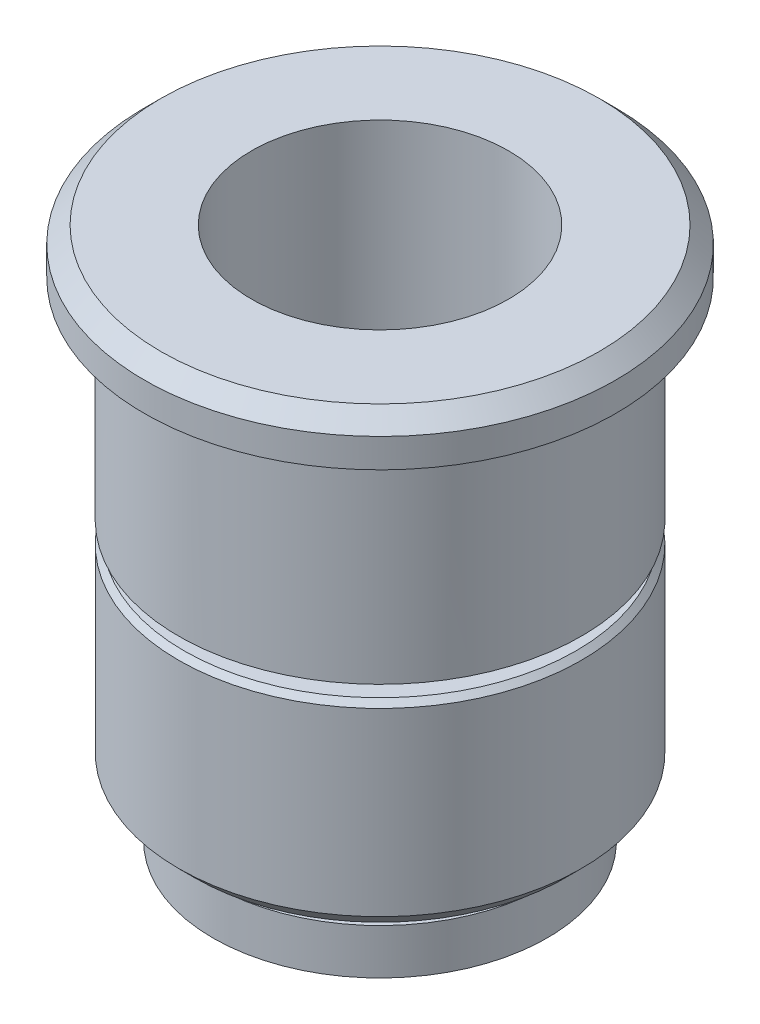
ISO-10303-21;
HEADER;
FILE_DESCRIPTION(('STEP AP214'),'2;1');
FILE_NAME('part.step','',(''),(''),'','','');
FILE_SCHEMA(('AUTOMOTIVE_DESIGN { 1 0 10303 214 1 1 1 1 }'));
ENDSEC;
DATA;
#1=APPLICATION_CONTEXT('core data for automotive mechanical design processes');
#2=APPLICATION_PROTOCOL_DEFINITION('international standard','automotive_design',2000,#1);
#3=PRODUCT_CONTEXT('',#1,'mechanical');
#4=PRODUCT('Part','Part','',(#3));
#5=PRODUCT_RELATED_PRODUCT_CATEGORY('part','',(#4));
#6=PRODUCT_DEFINITION_FORMATION('','',#4);
#7=PRODUCT_DEFINITION_CONTEXT('part definition',#1,'design');
#8=PRODUCT_DEFINITION('design','',#6,#7);
#9=PRODUCT_DEFINITION_SHAPE('','',#8);
#10=(LENGTH_UNIT() NAMED_UNIT(*) SI_UNIT(.MILLI.,.METRE.));
#11=(NAMED_UNIT(*) PLANE_ANGLE_UNIT() SI_UNIT($,.RADIAN.));
#12=(NAMED_UNIT(*) SI_UNIT($,.STERADIAN.) SOLID_ANGLE_UNIT());
#13=UNCERTAINTY_MEASURE_WITH_UNIT(LENGTH_MEASURE(1.E-05),#10,'distance_accuracy_value','');
#14=(GEOMETRIC_REPRESENTATION_CONTEXT(3) GLOBAL_UNCERTAINTY_ASSIGNED_CONTEXT((#13)) GLOBAL_UNIT_ASSIGNED_CONTEXT((#10,
#11,#12)) REPRESENTATION_CONTEXT('',''));
#15=CARTESIAN_POINT('',(0.,0.,0.));
#16=DIRECTION('',(0.,0.,1.));
#17=DIRECTION('',(1.,0.,0.));
#18=AXIS2_PLACEMENT_3D('',#15,#16,#17);
#19=CARTESIAN_POINT('',(0.,0.,0.));
#20=DIRECTION('',(0.,-1.,0.));
#21=DIRECTION('',(0.,0.,-1.));
#22=AXIS2_PLACEMENT_3D('',#19,#20,#21);
#23=PLANE('',#22);
#24=CARTESIAN_POINT('',(0.,0.,0.));
#25=DIRECTION('',(0.,-1.,0.));
#26=DIRECTION('',(0.,0.,-1.));
#27=AXIS2_PLACEMENT_3D('',#24,#25,#26);
#28=CIRCLE('',#27,1.5);
#29=CARTESIAN_POINT('',(0.,0.,-1.5));
#30=VERTEX_POINT('',#29);
#31=EDGE_CURVE('E97',#30,#30,#28,.T.);
#32=ORIENTED_EDGE('',*,*,#31,.F.);
#33=EDGE_LOOP('',(#32));
#34=FACE_BOUND('',#33,.T.);
#35=CARTESIAN_POINT('',(0.,0.,0.));
#36=DIRECTION('',(0.,-1.,0.));
#37=DIRECTION('',(0.,0.,-1.));
#38=AXIS2_PLACEMENT_3D('',#35,#36,#37);
#39=CIRCLE('',#38,1.95);
#40=CARTESIAN_POINT('',(0.,0.,-1.95));
#41=VERTEX_POINT('',#40);
#42=EDGE_CURVE('E64',#41,#41,#39,.T.);
#43=ORIENTED_EDGE('',*,*,#42,.T.);
#44=EDGE_LOOP('',(#43));
#45=FACE_BOUND('',#44,.T.);
#46=ADVANCED_FACE('F32',(#34,#45),#23,.T.);
#47=CARTESIAN_POINT('',(0.,0.,0.));
#48=DIRECTION('',(0.,-1.,0.));
#49=DIRECTION('',(0.,0.,-1.));
#50=AXIS2_PLACEMENT_3D('',#47,#48,#49);
#51=CYLINDRICAL_SURFACE('',#50,1.95);
#52=CARTESIAN_POINT('',(0.,0.53,0.));
#53=DIRECTION('',(0.,-1.,0.));
#54=DIRECTION('',(0.,0.,-1.));
#55=AXIS2_PLACEMENT_3D('',#52,#53,#54);
#56=CIRCLE('',#55,1.95);
#57=CARTESIAN_POINT('',(0.,0.53,-1.95));
#58=VERTEX_POINT('',#57);
#59=EDGE_CURVE('E67',#58,#58,#56,.T.);
#60=ORIENTED_EDGE('',*,*,#59,.T.);
#61=EDGE_LOOP('',(#60));
#62=FACE_BOUND('',#61,.T.);
#63=ORIENTED_EDGE('',*,*,#42,.F.);
#64=EDGE_LOOP('',(#63));
#65=FACE_BOUND('',#64,.T.);
#66=ADVANCED_FACE('F105',(#62,#65),#51,.T.);
#67=CARTESIAN_POINT('',(1.95,0.53,0.));
#68=DIRECTION('',(0.,1.,0.));
#69=DIRECTION('',(0.,0.,1.));
#70=AXIS2_PLACEMENT_3D('',#67,#68,#69);
#71=PLANE('',#70);
#72=CARTESIAN_POINT('',(0.,0.529999999999999,0.));
#73=DIRECTION('',(0.,-1.,0.));
#74=DIRECTION('',(0.,0.,-1.));
#75=AXIS2_PLACEMENT_3D('',#72,#73,#74);
#76=CIRCLE('',#75,1.725);
#77=CARTESIAN_POINT('',(0.,0.529999999999999,-1.725));
#78=VERTEX_POINT('',#77);
#79=EDGE_CURVE('E70',#78,#78,#76,.T.);
#80=ORIENTED_EDGE('',*,*,#79,.T.);
#81=EDGE_LOOP('',(#80));
#82=FACE_BOUND('',#81,.T.);
#83=ORIENTED_EDGE('',*,*,#59,.F.);
#84=EDGE_LOOP('',(#83));
#85=FACE_BOUND('',#84,.T.);
#86=ADVANCED_FACE('F110',(#82,#85),#71,.T.);
#87=CARTESIAN_POINT('',(0.,0.,0.));
#88=DIRECTION('',(0.,-1.,0.));
#89=DIRECTION('',(0.,0.,-1.));
#90=AXIS2_PLACEMENT_3D('',#87,#88,#89);
#91=CYLINDRICAL_SURFACE('',#90,1.725);
#92=CARTESIAN_POINT('',(0.,0.709999999999999,0.));
#93=DIRECTION('',(0.,-1.,0.));
#94=DIRECTION('',(0.,0.,-1.));
#95=AXIS2_PLACEMENT_3D('',#92,#93,#94);
#96=CIRCLE('',#95,1.725);
#97=CARTESIAN_POINT('',(0.,0.709999999999999,-1.725));
#98=VERTEX_POINT('',#97);
#99=EDGE_CURVE('E73',#98,#98,#96,.T.);
#100=ORIENTED_EDGE('',*,*,#99,.T.);
#101=EDGE_LOOP('',(#100));
#102=FACE_BOUND('',#101,.T.);
#103=ORIENTED_EDGE('',*,*,#79,.F.);
#104=EDGE_LOOP('',(#103));
#105=FACE_BOUND('',#104,.T.);
#106=ADVANCED_FACE('F116',(#102,#105),#91,.T.);
#107=CARTESIAN_POINT('',(1.725,0.709999999999999,0.));
#108=DIRECTION('',(0.,-1.,0.));
#109=DIRECTION('',(0.,0.,-1.));
#110=AXIS2_PLACEMENT_3D('',#107,#108,#109);
#111=PLANE('',#110);
#112=CARTESIAN_POINT('',(0.,0.709999999999999,0.));
#113=DIRECTION('',(0.,-1.,0.));
#114=DIRECTION('',(0.,0.,-1.));
#115=AXIS2_PLACEMENT_3D('',#112,#113,#114);
#116=CIRCLE('',#115,2.1575);
#117=CARTESIAN_POINT('',(0.,0.709999999999999,2.1575));
#118=VERTEX_POINT('',#117);
#119=EDGE_CURVE('E47',#118,#118,#116,.T.);
#120=ORIENTED_EDGE('',*,*,#119,.T.);
#121=EDGE_LOOP('',(#120));
#122=FACE_BOUND('',#121,.T.);
#123=ORIENTED_EDGE('',*,*,#99,.F.);
#124=EDGE_LOOP('',(#123));
#125=FACE_BOUND('',#124,.T.);
#126=ADVANCED_FACE('F139',(#122,#125),#111,.T.);
#127=CARTESIAN_POINT('',(0.,0.,0.));
#128=DIRECTION('',(0.,-1.,0.));
#129=DIRECTION('',(0.,0.,-1.));
#130=AXIS2_PLACEMENT_3D('',#127,#128,#129);
#131=CYLINDRICAL_SURFACE('',#130,2.35);
#132=CARTESIAN_POINT('',(0.,0.902499999999998,0.));
#133=DIRECTION('',(0.,-1.,0.));
#134=DIRECTION('',(0.,0.,-1.));
#135=AXIS2_PLACEMENT_3D('',#132,#133,#134);
#136=CIRCLE('',#135,2.35);
#137=CARTESIAN_POINT('',(0.,0.902499999999998,2.35));
#138=VERTEX_POINT('',#137);
#139=EDGE_CURVE('E43',#138,#138,#136,.F.);
#140=ORIENTED_EDGE('',*,*,#139,.T.);
#141=EDGE_LOOP('',(#140));
#142=FACE_BOUND('',#141,.T.);
#143=CARTESIAN_POINT('',(0.,3.0065,0.));
#144=DIRECTION('',(0.,1.,0.));
#145=DIRECTION('',(0.,0.,1.));
#146=AXIS2_PLACEMENT_3D('',#143,#144,#145);
#147=CIRCLE('',#146,2.35);
#148=CARTESIAN_POINT('',(0.,3.0065,2.35));
#149=VERTEX_POINT('',#148);
#150=EDGE_CURVE('E61',#149,#149,#147,.F.);
#151=ORIENTED_EDGE('',*,*,#150,.T.);
#152=EDGE_LOOP('',(#151));
#153=FACE_BOUND('',#152,.T.);
#154=ADVANCED_FACE('F142',(#142,#153),#131,.T.);
#155=CARTESIAN_POINT('',(2.35,3.07,0.));
#156=DIRECTION('',(0.,1.,0.));
#157=DIRECTION('',(0.,0.,1.));
#158=AXIS2_PLACEMENT_3D('',#155,#156,#157);
#159=PLANE('',#158);
#160=CARTESIAN_POINT('',(0.,3.07,0.));
#161=DIRECTION('',(0.,1.,0.));
#162=DIRECTION('',(0.,0.,1.));
#163=AXIS2_PLACEMENT_3D('',#160,#161,#162);
#164=CIRCLE('',#163,2.2865);
#165=CARTESIAN_POINT('',(0.,3.07,2.2865));
#166=VERTEX_POINT('',#165);
#167=EDGE_CURVE('E58',#166,#166,#164,.T.);
#168=ORIENTED_EDGE('',*,*,#167,.T.);
#169=EDGE_LOOP('',(#168));
#170=FACE_BOUND('',#169,.T.);
#171=CARTESIAN_POINT('',(0.,3.07,0.));
#172=DIRECTION('',(0.,-1.,0.));
#173=DIRECTION('',(0.,0.,-1.));
#174=AXIS2_PLACEMENT_3D('',#171,#172,#173);
#175=CIRCLE('',#174,1.725);
#176=CARTESIAN_POINT('',(0.,3.07,-1.725));
#177=VERTEX_POINT('',#176);
#178=EDGE_CURVE('E76',#177,#177,#175,.T.);
#179=ORIENTED_EDGE('',*,*,#178,.T.);
#180=EDGE_LOOP('',(#179));
#181=FACE_BOUND('',#180,.T.);
#182=ADVANCED_FACE('F156',(#170,#181),#159,.T.);
#183=CARTESIAN_POINT('',(0.,0.,0.));
#184=DIRECTION('',(0.,-1.,0.));
#185=DIRECTION('',(0.,0.,-1.));
#186=AXIS2_PLACEMENT_3D('',#183,#184,#185);
#187=CYLINDRICAL_SURFACE('',#186,1.725);
#188=CARTESIAN_POINT('',(0.,3.25,0.));
#189=DIRECTION('',(0.,-1.,0.));
#190=DIRECTION('',(0.,0.,-1.));
#191=AXIS2_PLACEMENT_3D('',#188,#189,#190);
#192=CIRCLE('',#191,1.725);
#193=CARTESIAN_POINT('',(0.,3.25,-1.725));
#194=VERTEX_POINT('',#193);
#195=EDGE_CURVE('E79',#194,#194,#192,.T.);
#196=ORIENTED_EDGE('',*,*,#195,.T.);
#197=EDGE_LOOP('',(#196));
#198=FACE_BOUND('',#197,.T.);
#199=ORIENTED_EDGE('',*,*,#178,.F.);
#200=EDGE_LOOP('',(#199));
#201=FACE_BOUND('',#200,.T.);
#202=ADVANCED_FACE('F160',(#198,#201),#187,.T.);
#203=CARTESIAN_POINT('',(1.725,3.25,0.));
#204=DIRECTION('',(0.,-1.,0.));
#205=DIRECTION('',(0.,0.,-1.));
#206=AXIS2_PLACEMENT_3D('',#203,#204,#205);
#207=PLANE('',#206);
#208=CARTESIAN_POINT('',(0.,3.25,0.));
#209=DIRECTION('',(0.,-1.,0.));
#210=DIRECTION('',(0.,0.,-1.));
#211=AXIS2_PLACEMENT_3D('',#208,#209,#210);
#212=CIRCLE('',#211,2.35);
#213=CARTESIAN_POINT('',(0.,3.25,-2.35));
#214=VERTEX_POINT('',#213);
#215=EDGE_CURVE('E82',#214,#214,#212,.T.);
#216=ORIENTED_EDGE('',*,*,#215,.T.);
#217=EDGE_LOOP('',(#216));
#218=FACE_BOUND('',#217,.T.);
#219=ORIENTED_EDGE('',*,*,#195,.F.);
#220=EDGE_LOOP('',(#219));
#221=FACE_BOUND('',#220,.T.);
#222=ADVANCED_FACE('F164',(#218,#221),#207,.T.);
#223=CARTESIAN_POINT('',(0.,0.,0.));
#224=DIRECTION('',(0.,-1.,0.));
#225=DIRECTION('',(0.,0.,-1.));
#226=AXIS2_PLACEMENT_3D('',#223,#224,#225);
#227=CYLINDRICAL_SURFACE('',#226,2.35);
#228=CARTESIAN_POINT('',(0.,5.5465,0.));
#229=DIRECTION('',(0.,1.,0.));
#230=DIRECTION('',(0.,0.,1.));
#231=AXIS2_PLACEMENT_3D('',#228,#229,#230);
#232=CIRCLE('',#231,2.35);
#233=CARTESIAN_POINT('',(0.,5.5465,2.35));
#234=VERTEX_POINT('',#233);
#235=EDGE_CURVE('E55',#234,#234,#232,.F.);
#236=ORIENTED_EDGE('',*,*,#235,.T.);
#237=EDGE_LOOP('',(#236));
#238=FACE_BOUND('',#237,.T.);
#239=ORIENTED_EDGE('',*,*,#215,.F.);
#240=EDGE_LOOP('',(#239));
#241=FACE_BOUND('',#240,.T.);
#242=ADVANCED_FACE('F168',(#238,#241),#227,.T.);
#243=CARTESIAN_POINT('',(2.35,5.61,0.));
#244=DIRECTION('',(0.,1.,0.));
#245=DIRECTION('',(0.,0.,1.));
#246=AXIS2_PLACEMENT_3D('',#243,#244,#245);
#247=PLANE('',#246);
#248=CARTESIAN_POINT('',(0.,5.61,0.));
#249=DIRECTION('',(0.,1.,0.));
#250=DIRECTION('',(0.,0.,1.));
#251=AXIS2_PLACEMENT_3D('',#248,#249,#250);
#252=CIRCLE('',#251,2.2865);
#253=CARTESIAN_POINT('',(0.,5.61,2.2865));
#254=VERTEX_POINT('',#253);
#255=EDGE_CURVE('E52',#254,#254,#252,.T.);
#256=ORIENTED_EDGE('',*,*,#255,.T.);
#257=EDGE_LOOP('',(#256));
#258=FACE_BOUND('',#257,.T.);
#259=CARTESIAN_POINT('',(0.,5.61,0.));
#260=DIRECTION('',(0.,-1.,0.));
#261=DIRECTION('',(0.,0.,-1.));
#262=AXIS2_PLACEMENT_3D('',#259,#260,#261);
#263=CIRCLE('',#262,1.725);
#264=CARTESIAN_POINT('',(0.,5.61,-1.725));
#265=VERTEX_POINT('',#264);
#266=EDGE_CURVE('E85',#265,#265,#263,.T.);
#267=ORIENTED_EDGE('',*,*,#266,.T.);
#268=EDGE_LOOP('',(#267));
#269=FACE_BOUND('',#268,.T.);
#270=ADVANCED_FACE('F172',(#258,#269),#247,.T.);
#271=CARTESIAN_POINT('',(0.,0.,0.));
#272=DIRECTION('',(0.,-1.,0.));
#273=DIRECTION('',(0.,0.,-1.));
#274=AXIS2_PLACEMENT_3D('',#271,#272,#273);
#275=CYLINDRICAL_SURFACE('',#274,1.725);
#276=CARTESIAN_POINT('',(0.,5.7,0.));
#277=DIRECTION('',(0.,-1.,0.));
#278=DIRECTION('',(0.,0.,-1.));
#279=AXIS2_PLACEMENT_3D('',#276,#277,#278);
#280=CIRCLE('',#279,1.725);
#281=CARTESIAN_POINT('',(0.,5.7,-1.725));
#282=VERTEX_POINT('',#281);
#283=EDGE_CURVE('E88',#282,#282,#280,.T.);
#284=ORIENTED_EDGE('',*,*,#283,.T.);
#285=EDGE_LOOP('',(#284));
#286=FACE_BOUND('',#285,.T.);
#287=ORIENTED_EDGE('',*,*,#266,.F.);
#288=EDGE_LOOP('',(#287));
#289=FACE_BOUND('',#288,.T.);
#290=ADVANCED_FACE('F176',(#286,#289),#275,.T.);
#291=CARTESIAN_POINT('',(1.725,5.7,0.));
#292=DIRECTION('',(0.,-1.,0.));
#293=DIRECTION('',(0.,0.,-1.));
#294=AXIS2_PLACEMENT_3D('',#291,#292,#293);
#295=PLANE('',#294);
#296=CARTESIAN_POINT('',(0.,5.7,0.));
#297=DIRECTION('',(0.,-1.,0.));
#298=DIRECTION('',(0.,0.,-1.));
#299=AXIS2_PLACEMENT_3D('',#296,#297,#298);
#300=CIRCLE('',#299,2.75);
#301=CARTESIAN_POINT('',(0.,5.7,-2.75));
#302=VERTEX_POINT('',#301);
#303=EDGE_CURVE('E91',#302,#302,#300,.T.);
#304=ORIENTED_EDGE('',*,*,#303,.T.);
#305=EDGE_LOOP('',(#304));
#306=FACE_BOUND('',#305,.T.);
#307=ORIENTED_EDGE('',*,*,#283,.F.);
#308=EDGE_LOOP('',(#307));
#309=FACE_BOUND('',#308,.T.);
#310=ADVANCED_FACE('F180',(#306,#309),#295,.T.);
#311=CARTESIAN_POINT('',(0.,0.,0.));
#312=DIRECTION('',(0.,-1.,0.));
#313=DIRECTION('',(0.,0.,-1.));
#314=AXIS2_PLACEMENT_3D('',#311,#312,#313);
#315=CYLINDRICAL_SURFACE('',#314,2.75);
#316=CARTESIAN_POINT('',(0.,6.0375,0.));
#317=DIRECTION('',(0.,1.,0.));
#318=DIRECTION('',(0.,0.,1.));
#319=AXIS2_PLACEMENT_3D('',#316,#317,#318);
#320=CIRCLE('',#319,2.75);
#321=CARTESIAN_POINT('',(0.,6.0375,-2.75));
#322=VERTEX_POINT('',#321);
#323=EDGE_CURVE('E39',#322,#322,#320,.F.);
#324=ORIENTED_EDGE('',*,*,#323,.T.);
#325=EDGE_LOOP('',(#324));
#326=FACE_BOUND('',#325,.T.);
#327=ORIENTED_EDGE('',*,*,#303,.F.);
#328=EDGE_LOOP('',(#327));
#329=FACE_BOUND('',#328,.T.);
#330=ADVANCED_FACE('F184',(#326,#329),#315,.T.);
#331=CARTESIAN_POINT('',(2.75,6.23,0.));
#332=DIRECTION('',(0.,1.,0.));
#333=DIRECTION('',(0.,0.,1.));
#334=AXIS2_PLACEMENT_3D('',#331,#332,#333);
#335=PLANE('',#334);
#336=CARTESIAN_POINT('',(0.,6.23,0.));
#337=DIRECTION('',(0.,1.,0.));
#338=DIRECTION('',(0.,0.,1.));
#339=AXIS2_PLACEMENT_3D('',#336,#337,#338);
#340=CIRCLE('',#339,2.5575);
#341=CARTESIAN_POINT('',(0.,6.23,-2.5575));
#342=VERTEX_POINT('',#341);
#343=EDGE_CURVE('E10',#342,#342,#340,.T.);
#344=ORIENTED_EDGE('',*,*,#343,.T.);
#345=EDGE_LOOP('',(#344));
#346=FACE_BOUND('',#345,.T.);
#347=CARTESIAN_POINT('',(0.,6.23,0.));
#348=DIRECTION('',(0.,-1.,0.));
#349=DIRECTION('',(0.,0.,-1.));
#350=AXIS2_PLACEMENT_3D('',#347,#348,#349);
#351=CIRCLE('',#350,1.5);
#352=CARTESIAN_POINT('',(0.,6.23,-1.5));
#353=VERTEX_POINT('',#352);
#354=EDGE_CURVE('E94',#353,#353,#351,.T.);
#355=ORIENTED_EDGE('',*,*,#354,.T.);
#356=EDGE_LOOP('',(#355));
#357=FACE_BOUND('',#356,.T.);
#358=ADVANCED_FACE('F188',(#346,#357),#335,.T.);
#359=CARTESIAN_POINT('',(0.,0.,0.));
#360=DIRECTION('',(0.,-1.,0.));
#361=DIRECTION('',(0.,0.,-1.));
#362=AXIS2_PLACEMENT_3D('',#359,#360,#361);
#363=CYLINDRICAL_SURFACE('',#362,1.5);
#364=ORIENTED_EDGE('',*,*,#354,.F.);
#365=EDGE_LOOP('',(#364));
#366=FACE_BOUND('',#365,.T.);
#367=ORIENTED_EDGE('',*,*,#31,.T.);
#368=EDGE_LOOP('',(#367));
#369=FACE_BOUND('',#368,.T.);
#370=ADVANCED_FACE('F101',(#366,#369),#363,.F.);
#371=CARTESIAN_POINT('',(0.,3.0065,0.));
#372=DIRECTION('',(0.,-1.,0.));
#373=DIRECTION('',(0.,0.,-1.));
#374=AXIS2_PLACEMENT_3D('',#371,#372,#373);
#375=CONICAL_SURFACE('',#374,2.35,0.785398163397448);
#376=ORIENTED_EDGE('',*,*,#167,.F.);
#377=EDGE_LOOP('',(#376));
#378=FACE_BOUND('',#377,.T.);
#379=ORIENTED_EDGE('',*,*,#150,.F.);
#380=EDGE_LOOP('',(#379));
#381=FACE_BOUND('',#380,.T.);
#382=ADVANCED_FACE('F121',(#378,#381),#375,.T.);
#383=CARTESIAN_POINT('',(0.,5.5465,0.));
#384=DIRECTION('',(0.,-1.,0.));
#385=DIRECTION('',(0.,0.,-1.));
#386=AXIS2_PLACEMENT_3D('',#383,#384,#385);
#387=CONICAL_SURFACE('',#386,2.35,0.785398163397438);
#388=ORIENTED_EDGE('',*,*,#255,.F.);
#389=EDGE_LOOP('',(#388));
#390=FACE_BOUND('',#389,.T.);
#391=ORIENTED_EDGE('',*,*,#235,.F.);
#392=EDGE_LOOP('',(#391));
#393=FACE_BOUND('',#392,.T.);
#394=ADVANCED_FACE('F124',(#390,#393),#387,.T.);
#395=CARTESIAN_POINT('',(0.,0.709999999999999,0.));
#396=DIRECTION('',(0.,1.,0.));
#397=DIRECTION('',(0.,0.,1.));
#398=AXIS2_PLACEMENT_3D('',#395,#396,#397);
#399=CONICAL_SURFACE('',#398,2.1575,0.785398163397443);
#400=CARTESIAN_POINT('',(0.,0.902499999999998,2.35));
#401=CARTESIAN_POINT('',(0.,0.900494791666665,2.34799479166667));
#402=CARTESIAN_POINT('',(0.,0.898489583333332,2.34598958333333));
#403=CARTESIAN_POINT('',(0.,0.894479166666665,2.34197916666667));
#404=CARTESIAN_POINT('',(0.,0.892473958333332,2.33997395833333));
#405=CARTESIAN_POINT('',(0.,0.888463541666665,2.33596354166667));
#406=CARTESIAN_POINT('',(0.,0.886458333333332,2.33395833333333));
#407=CARTESIAN_POINT('',(0.,0.882447916666665,2.32994791666667));
#408=CARTESIAN_POINT('',(0.,0.880442708333332,2.32794270833333));
#409=CARTESIAN_POINT('',(0.,0.876432291666665,2.32393229166667));
#410=CARTESIAN_POINT('',(0.,0.874427083333332,2.32192708333333));
#411=CARTESIAN_POINT('',(0.,0.870416666666665,2.31791666666667));
#412=CARTESIAN_POINT('',(0.,0.868411458333332,2.31591145833333));
#413=CARTESIAN_POINT('',(0.,0.864401041666665,2.31190104166667));
#414=CARTESIAN_POINT('',(0.,0.862395833333332,2.30989583333333));
#415=CARTESIAN_POINT('',(0.,0.858385416666665,2.30588541666667));
#416=CARTESIAN_POINT('',(0.,0.856380208333332,2.30388020833333));
#417=CARTESIAN_POINT('',(0.,0.852369791666665,2.29986979166667));
#418=CARTESIAN_POINT('',(0.,0.850364583333332,2.29786458333333));
#419=CARTESIAN_POINT('',(0.,0.846354166666665,2.29385416666667));
#420=CARTESIAN_POINT('',(0.,0.844348958333332,2.29184895833333));
#421=CARTESIAN_POINT('',(0.,0.840338541666665,2.28783854166667));
#422=CARTESIAN_POINT('',(0.,0.838333333333332,2.28583333333333));
#423=CARTESIAN_POINT('',(0.,0.834322916666665,2.28182291666667));
#424=CARTESIAN_POINT('',(0.,0.832317708333332,2.27981770833333));
#425=CARTESIAN_POINT('',(0.,0.828307291666665,2.27580729166667));
#426=CARTESIAN_POINT('',(0.,0.826302083333332,2.27380208333333));
#427=CARTESIAN_POINT('',(0.,0.822291666666665,2.26979166666667));
#428=CARTESIAN_POINT('',(0.,0.820286458333332,2.26778645833333));
#429=CARTESIAN_POINT('',(0.,0.816276041666665,2.26377604166667));
#430=CARTESIAN_POINT('',(0.,0.814270833333332,2.26177083333333));
#431=CARTESIAN_POINT('',(0.,0.810260416666665,2.25776041666667));
#432=CARTESIAN_POINT('',(0.,0.808255208333332,2.25575520833334));
#433=CARTESIAN_POINT('',(0.,0.804244791666665,2.25174479166667));
#434=CARTESIAN_POINT('',(0.,0.802239583333332,2.24973958333334));
#435=CARTESIAN_POINT('',(0.,0.798229166666665,2.24572916666667));
#436=CARTESIAN_POINT('',(0.,0.796223958333332,2.24372395833334));
#437=CARTESIAN_POINT('',(0.,0.792213541666665,2.23971354166667));
#438=CARTESIAN_POINT('',(0.,0.790208333333332,2.23770833333334));
#439=CARTESIAN_POINT('',(0.,0.786197916666665,2.23369791666667));
#440=CARTESIAN_POINT('',(0.,0.784192708333332,2.23169270833334));
#441=CARTESIAN_POINT('',(0.,0.780182291666665,2.22768229166667));
#442=CARTESIAN_POINT('',(0.,0.778177083333332,2.22567708333334));
#443=CARTESIAN_POINT('',(0.,0.774166666666666,2.22166666666667));
#444=CARTESIAN_POINT('',(0.,0.772161458333332,2.21966145833334));
#445=CARTESIAN_POINT('',(0.,0.768151041666666,2.21565104166667));
#446=CARTESIAN_POINT('',(0.,0.766145833333332,2.21364583333334));
#447=CARTESIAN_POINT('',(0.,0.762135416666666,2.20963541666667));
#448=CARTESIAN_POINT('',(0.,0.760130208333332,2.20763020833334));
#449=CARTESIAN_POINT('',(0.,0.756119791666666,2.20361979166667));
#450=CARTESIAN_POINT('',(0.,0.754114583333332,2.20161458333334));
#451=CARTESIAN_POINT('',(0.,0.750104166666666,2.19760416666667));
#452=CARTESIAN_POINT('',(0.,0.748098958333332,2.19559895833334));
#453=CARTESIAN_POINT('',(0.,0.744088541666666,2.19158854166667));
#454=CARTESIAN_POINT('',(0.,0.742083333333332,2.18958333333334));
#455=CARTESIAN_POINT('',(0.,0.738072916666666,2.18557291666667));
#456=CARTESIAN_POINT('',(0.,0.736067708333332,2.18356770833334));
#457=CARTESIAN_POINT('',(0.,0.732057291666666,2.17955729166667));
#458=CARTESIAN_POINT('',(0.,0.730052083333332,2.17755208333334));
#459=CARTESIAN_POINT('',(0.,0.726041666666666,2.17354166666667));
#460=CARTESIAN_POINT('',(0.,0.724036458333333,2.17153645833334));
#461=CARTESIAN_POINT('',(0.,0.720026041666666,2.16752604166667));
#462=CARTESIAN_POINT('',(0.,0.718020833333333,2.16552083333334));
#463=CARTESIAN_POINT('',(0.,0.714010416666666,2.16151041666667));
#464=CARTESIAN_POINT('',(0.,0.712005208333332,2.15950520833334));
#465=CARTESIAN_POINT('',(0.,0.709999999999999,2.1575));
#466=B_SPLINE_CURVE_WITH_KNOTS('',3,(#400,#401,#402,#403,#404,#405,#406,#407,#408,#409,#410,
#411,#412,#413,#414,#415,#416,#417,#418,#419,#420,#421,#422,#423,#424,#425,#426,#427,#428,#429,
#430,#431,#432,#433,#434,#435,#436,#437,#438,#439,#440,#441,#442,#443,#444,#445,#446,#447,#448,
#449,#450,#451,#452,#453,#454,#455,#456,#457,#458,#459,#460,#461,#462,#463,#464,#465),
.UNSPECIFIED.,.F.,.F.,(4,2,2,2,2,2,2,2,2,2,2,2,2,2,2,2,2,2,2,2,2,2,2,2,2,2,2,2,2,2,2,2,4),(0.,
0.00850737846115057,0.0170147569223011,0.0255221353834518,0.0340295138446021,0.0425368923057526,
0.0510442707669032,0.0595516492280538,0.0680590276892044,0.076566406150355,0.0850737846115056,
0.0935811630726562,0.102088541533807,0.110595919994957,0.119103298456108,0.127610676917258,
0.136118055378409,0.144625433839559,0.15313281230071,0.161640190761861,0.170147569223011,
0.178654947684162,0.187162326145312,0.195669704606463,0.204177083067614,0.212684461528764,
0.221191839989914,0.229699218451065,0.238206596912216,0.246713975373366,0.255221353834517,
0.263728732295667,0.272236110756818),.UNSPECIFIED.);
#467=EDGE_CURVE('BSEAM127',#138,#118,#466,.T.);
#468=ORIENTED_EDGE('',*,*,#139,.F.);
#469=ORIENTED_EDGE('',*,*,#119,.F.);
#470=ORIENTED_EDGE('',*,*,#467,.T.);
#471=ORIENTED_EDGE('',*,*,#467,.F.);
#472=EDGE_LOOP('',(#468,#470,#469,#471));
#473=FACE_BOUND('',#472,.T.);
#474=ADVANCED_FACE('F127',(#473),#399,.T.);
#475=CARTESIAN_POINT('',(0.,6.0375,0.));
#476=DIRECTION('',(0.,-1.,0.));
#477=DIRECTION('',(0.,0.,-1.));
#478=AXIS2_PLACEMENT_3D('',#475,#476,#477);
#479=CONICAL_SURFACE('',#478,2.75,0.785398163397455);
#480=CARTESIAN_POINT('',(0.,6.23,-2.5575));
#481=CARTESIAN_POINT('',(0.,6.22799479166667,-2.55950520833333));
#482=CARTESIAN_POINT('',(0.,6.22598958333333,-2.56151041666667));
#483=CARTESIAN_POINT('',(0.,6.22197916666667,-2.56552083333333));
#484=CARTESIAN_POINT('',(0.,6.21997395833333,-2.56752604166667));
#485=CARTESIAN_POINT('',(0.,6.21596354166667,-2.57153645833333));
#486=CARTESIAN_POINT('',(0.,6.21395833333333,-2.57354166666667));
#487=CARTESIAN_POINT('',(0.,6.20994791666667,-2.57755208333333));
#488=CARTESIAN_POINT('',(0.,6.20794270833333,-2.57955729166667));
#489=CARTESIAN_POINT('',(0.,6.20393229166667,-2.58356770833333));
#490=CARTESIAN_POINT('',(0.,6.20192708333333,-2.58557291666667));
#491=CARTESIAN_POINT('',(0.,6.19791666666667,-2.58958333333333));
#492=CARTESIAN_POINT('',(0.,6.19591145833333,-2.59158854166667));
#493=CARTESIAN_POINT('',(0.,6.19190104166667,-2.59559895833333));
#494=CARTESIAN_POINT('',(0.,6.18989583333333,-2.59760416666667));
#495=CARTESIAN_POINT('',(0.,6.18588541666667,-2.60161458333333));
#496=CARTESIAN_POINT('',(0.,6.18388020833333,-2.60361979166667));
#497=CARTESIAN_POINT('',(0.,6.17986979166667,-2.60763020833333));
#498=CARTESIAN_POINT('',(0.,6.17786458333333,-2.60963541666667));
#499=CARTESIAN_POINT('',(0.,6.17385416666667,-2.61364583333333));
#500=CARTESIAN_POINT('',(0.,6.17184895833333,-2.61565104166667));
#501=CARTESIAN_POINT('',(0.,6.16783854166667,-2.61966145833333));
#502=CARTESIAN_POINT('',(0.,6.16583333333333,-2.62166666666667));
#503=CARTESIAN_POINT('',(0.,6.16182291666667,-2.62567708333333));
#504=CARTESIAN_POINT('',(0.,6.15981770833333,-2.62768229166667));
#505=CARTESIAN_POINT('',(0.,6.15580729166667,-2.63169270833333));
#506=CARTESIAN_POINT('',(0.,6.15380208333333,-2.63369791666667));
#507=CARTESIAN_POINT('',(0.,6.14979166666667,-2.63770833333333));
#508=CARTESIAN_POINT('',(0.,6.14778645833333,-2.63971354166667));
#509=CARTESIAN_POINT('',(0.,6.14377604166667,-2.64372395833333));
#510=CARTESIAN_POINT('',(0.,6.14177083333333,-2.64572916666667));
#511=CARTESIAN_POINT('',(0.,6.13776041666667,-2.64973958333333));
#512=CARTESIAN_POINT('',(0.,6.13575520833333,-2.65174479166667));
#513=CARTESIAN_POINT('',(0.,6.13174479166667,-2.65575520833333));
#514=CARTESIAN_POINT('',(0.,6.12973958333333,-2.65776041666667));
#515=CARTESIAN_POINT('',(0.,6.12572916666667,-2.66177083333333));
#516=CARTESIAN_POINT('',(0.,6.12372395833333,-2.66377604166667));
#517=CARTESIAN_POINT('',(0.,6.11971354166667,-2.66778645833333));
#518=CARTESIAN_POINT('',(0.,6.11770833333333,-2.66979166666667));
#519=CARTESIAN_POINT('',(0.,6.11369791666667,-2.67380208333333));
#520=CARTESIAN_POINT('',(0.,6.11169270833333,-2.67580729166667));
#521=CARTESIAN_POINT('',(0.,6.10768229166667,-2.67981770833333));
#522=CARTESIAN_POINT('',(0.,6.10567708333333,-2.68182291666667));
#523=CARTESIAN_POINT('',(0.,6.10166666666667,-2.68583333333333));
#524=CARTESIAN_POINT('',(0.,6.09966145833333,-2.68783854166667));
#525=CARTESIAN_POINT('',(0.,6.09565104166667,-2.69184895833333));
#526=CARTESIAN_POINT('',(0.,6.09364583333333,-2.69385416666667));
#527=CARTESIAN_POINT('',(0.,6.08963541666667,-2.69786458333333));
#528=CARTESIAN_POINT('',(0.,6.08763020833333,-2.69986979166667));
#529=CARTESIAN_POINT('',(0.,6.08361979166667,-2.70388020833333));
#530=CARTESIAN_POINT('',(0.,6.08161458333333,-2.70588541666667));
#531=CARTESIAN_POINT('',(0.,6.07760416666667,-2.70989583333333));
#532=CARTESIAN_POINT('',(0.,6.07559895833333,-2.71190104166667));
#533=CARTESIAN_POINT('',(0.,6.07158854166667,-2.71591145833333));
#534=CARTESIAN_POINT('',(0.,6.06958333333333,-2.71791666666667));
#535=CARTESIAN_POINT('',(0.,6.06557291666667,-2.72192708333333));
#536=CARTESIAN_POINT('',(0.,6.06356770833333,-2.72393229166667));
#537=CARTESIAN_POINT('',(0.,6.05955729166667,-2.72794270833333));
#538=CARTESIAN_POINT('',(0.,6.05755208333333,-2.72994791666667));
#539=CARTESIAN_POINT('',(0.,6.05354166666667,-2.73395833333333));
#540=CARTESIAN_POINT('',(0.,6.05153645833333,-2.73596354166667));
#541=CARTESIAN_POINT('',(0.,6.04752604166667,-2.73997395833333));
#542=CARTESIAN_POINT('',(0.,6.04552083333333,-2.74197916666667));
#543=CARTESIAN_POINT('',(0.,6.04151041666667,-2.74598958333333));
#544=CARTESIAN_POINT('',(0.,6.03950520833333,-2.74799479166667));
#545=CARTESIAN_POINT('',(0.,6.0375,-2.75));
#546=B_SPLINE_CURVE_WITH_KNOTS('',3,(#480,#481,#482,#483,#484,#485,#486,#487,#488,#489,#490,
#491,#492,#493,#494,#495,#496,#497,#498,#499,#500,#501,#502,#503,#504,#505,#506,#507,#508,#509,
#510,#511,#512,#513,#514,#515,#516,#517,#518,#519,#520,#521,#522,#523,#524,#525,#526,#527,#528,
#529,#530,#531,#532,#533,#534,#535,#536,#537,#538,#539,#540,#541,#542,#543,#544,#545),
.UNSPECIFIED.,.F.,.F.,(4,2,2,2,2,2,2,2,2,2,2,2,2,2,2,2,2,2,2,2,2,2,2,2,2,2,2,2,2,2,2,2,4),(0.,
0.00850737846115027,0.0170147569223015,0.0255221353834517,0.0340295138446026,0.0425368923057529,
0.0510442707669037,0.0595516492280543,0.0680590276892052,0.0765664061503555,0.0850737846115066,
0.0935811630726569,0.102088541533808,0.110595919994958,0.119103298456109,0.127610676917259,
0.13611805537841,0.144625433839561,0.153132812300712,0.161640190761863,0.170147569223013,
0.178654947684164,0.187162326145314,0.195669704606465,0.204177083067616,0.212684461528766,
0.221191839989917,0.229699218451068,0.238206596912218,0.246713975373369,0.255221353834519,
0.26372873229567,0.272236110756821),.UNSPECIFIED.);
#547=EDGE_CURVE('BSEAM34',#342,#322,#546,.T.);
#548=ORIENTED_EDGE('',*,*,#343,.F.);
#549=ORIENTED_EDGE('',*,*,#323,.F.);
#550=ORIENTED_EDGE('',*,*,#547,.T.);
#551=ORIENTED_EDGE('',*,*,#547,.F.);
#552=EDGE_LOOP('',(#548,#550,#549,#551));
#553=FACE_BOUND('',#552,.T.);
#554=ADVANCED_FACE('F34',(#553),#479,.T.);
#555=CLOSED_SHELL('',(#46,#66,#86,#106,#126,#154,#182,#202,#222,#242,#270,#290,#310,#330,#358,
#370,#382,#394,#474,#554));
#556=MANIFOLD_SOLID_BREP('B2',#555);
#557=ADVANCED_BREP_SHAPE_REPRESENTATION('',(#18,#556),#14);
#558=SHAPE_DEFINITION_REPRESENTATION(#9,#557);
ENDSEC;
END-ISO-10303-21;
